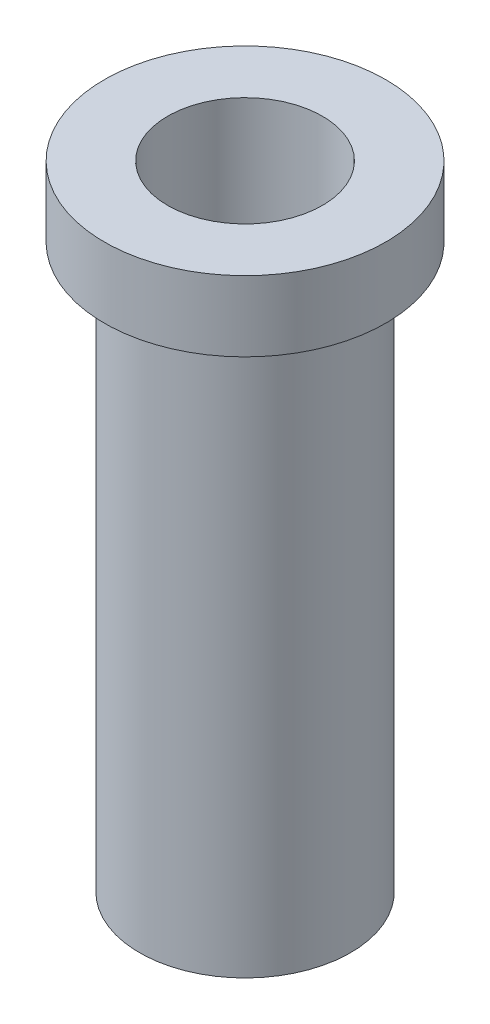
ISO-10303-21;
HEADER;
FILE_DESCRIPTION(('STEP AP214'),'2;1');
FILE_NAME('part.step','',(''),(''),'','','');
FILE_SCHEMA(('AUTOMOTIVE_DESIGN { 1 0 10303 214 1 1 1 1 }'));
ENDSEC;
DATA;
#1=APPLICATION_CONTEXT('core data for automotive mechanical design processes');
#2=APPLICATION_PROTOCOL_DEFINITION('international standard','automotive_design',2000,#1);
#3=PRODUCT_CONTEXT('',#1,'mechanical');
#4=PRODUCT('Part','Part','',(#3));
#5=PRODUCT_RELATED_PRODUCT_CATEGORY('part','',(#4));
#6=PRODUCT_DEFINITION_FORMATION('','',#4);
#7=PRODUCT_DEFINITION_CONTEXT('part definition',#1,'design');
#8=PRODUCT_DEFINITION('design','',#6,#7);
#9=PRODUCT_DEFINITION_SHAPE('','',#8);
#10=(LENGTH_UNIT() NAMED_UNIT(*) SI_UNIT(.MILLI.,.METRE.));
#11=(NAMED_UNIT(*) PLANE_ANGLE_UNIT() SI_UNIT($,.RADIAN.));
#12=(NAMED_UNIT(*) SI_UNIT($,.STERADIAN.) SOLID_ANGLE_UNIT());
#13=UNCERTAINTY_MEASURE_WITH_UNIT(LENGTH_MEASURE(1.E-05),#10,'distance_accuracy_value','');
#14=(GEOMETRIC_REPRESENTATION_CONTEXT(3) GLOBAL_UNCERTAINTY_ASSIGNED_CONTEXT((#13)) GLOBAL_UNIT_ASSIGNED_CONTEXT((#10,
#11,#12)) REPRESENTATION_CONTEXT('',''));
#15=CARTESIAN_POINT('',(0.,0.,0.));
#16=DIRECTION('',(0.,0.,1.));
#17=DIRECTION('',(1.,0.,0.));
#18=AXIS2_PLACEMENT_3D('',#15,#16,#17);
#19=CARTESIAN_POINT('',(7.5,0.,0.));
#20=DIRECTION('',(0.,-1.,0.));
#21=DIRECTION('',(0.,0.,-1.));
#22=AXIS2_PLACEMENT_3D('',#19,#20,#21);
#23=PLANE('',#22);
#24=CARTESIAN_POINT('',(0.,0.,0.));
#25=DIRECTION('',(0.,1.,0.));
#26=DIRECTION('',(0.,0.,1.));
#27=AXIS2_PLACEMENT_3D('',#24,#25,#26);
#28=CIRCLE('',#27,5.5);
#29=CARTESIAN_POINT('',(0.,0.,5.5));
#30=VERTEX_POINT('',#29);
#31=EDGE_CURVE('E56',#30,#30,#28,.T.);
#32=ORIENTED_EDGE('',*,*,#31,.T.);
#33=EDGE_LOOP('',(#32));
#34=FACE_BOUND('',#33,.T.);
#35=CARTESIAN_POINT('',(0.,0.,0.));
#36=DIRECTION('',(0.,-1.,0.));
#37=DIRECTION('',(0.,0.,-1.));
#38=AXIS2_PLACEMENT_3D('',#35,#36,#37);
#39=CIRCLE('',#38,7.5);
#40=CARTESIAN_POINT('',(0.,0.,-7.5));
#41=VERTEX_POINT('',#40);
#42=EDGE_CURVE('E51',#41,#41,#39,.T.);
#43=ORIENTED_EDGE('',*,*,#42,.T.);
#44=EDGE_LOOP('',(#43));
#45=FACE_BOUND('',#44,.T.);
#46=ADVANCED_FACE('F37',(#34,#45),#23,.T.);
#47=CARTESIAN_POINT('',(0.,45.,0.));
#48=DIRECTION('',(0.,1.,0.));
#49=DIRECTION('',(0.,0.,1.));
#50=AXIS2_PLACEMENT_3D('',#47,#48,#49);
#51=PLANE('',#50);
#52=CARTESIAN_POINT('',(0.,45.,0.));
#53=DIRECTION('',(0.,1.,0.));
#54=DIRECTION('',(0.,0.,1.));
#55=AXIS2_PLACEMENT_3D('',#52,#53,#54);
#56=CIRCLE('',#55,5.5);
#57=CARTESIAN_POINT('',(0.,45.,5.5));
#58=VERTEX_POINT('',#57);
#59=EDGE_CURVE('E57',#58,#58,#56,.T.);
#60=ORIENTED_EDGE('',*,*,#59,.F.);
#61=EDGE_LOOP('',(#60));
#62=FACE_BOUND('',#61,.T.);
#63=CARTESIAN_POINT('',(0.,45.,0.));
#64=DIRECTION('',(0.,-1.,0.));
#65=DIRECTION('',(0.,0.,-1.));
#66=AXIS2_PLACEMENT_3D('',#63,#64,#65);
#67=CIRCLE('',#66,10.);
#68=CARTESIAN_POINT('',(0.,45.,-10.));
#69=VERTEX_POINT('',#68);
#70=EDGE_CURVE('E10',#69,#69,#67,.T.);
#71=ORIENTED_EDGE('',*,*,#70,.F.);
#72=EDGE_LOOP('',(#71));
#73=FACE_BOUND('',#72,.T.);
#74=ADVANCED_FACE('F72',(#62,#73),#51,.T.);
#75=CARTESIAN_POINT('',(0.,0.,0.));
#76=DIRECTION('',(0.,-1.,0.));
#77=DIRECTION('',(0.,0.,-1.));
#78=AXIS2_PLACEMENT_3D('',#75,#76,#77);
#79=CYLINDRICAL_SURFACE('',#78,10.);
#80=ORIENTED_EDGE('',*,*,#70,.T.);
#81=EDGE_LOOP('',(#80));
#82=FACE_BOUND('',#81,.T.);
#83=CARTESIAN_POINT('',(0.,40.,0.));
#84=DIRECTION('',(0.,-1.,0.));
#85=DIRECTION('',(0.,0.,-1.));
#86=AXIS2_PLACEMENT_3D('',#83,#84,#85);
#87=CIRCLE('',#86,10.);
#88=CARTESIAN_POINT('',(0.,40.,-10.));
#89=VERTEX_POINT('',#88);
#90=EDGE_CURVE('E43',#89,#89,#87,.T.);
#91=ORIENTED_EDGE('',*,*,#90,.F.);
#92=EDGE_LOOP('',(#91));
#93=FACE_BOUND('',#92,.T.);
#94=ADVANCED_FACE('F75',(#82,#93),#79,.T.);
#95=CARTESIAN_POINT('',(10.,40.,0.));
#96=DIRECTION('',(0.,-1.,0.));
#97=DIRECTION('',(0.,0.,-1.));
#98=AXIS2_PLACEMENT_3D('',#95,#96,#97);
#99=PLANE('',#98);
#100=ORIENTED_EDGE('',*,*,#90,.T.);
#101=EDGE_LOOP('',(#100));
#102=FACE_BOUND('',#101,.T.);
#103=CARTESIAN_POINT('',(0.,40.,0.));
#104=DIRECTION('',(0.,-1.,0.));
#105=DIRECTION('',(0.,0.,-1.));
#106=AXIS2_PLACEMENT_3D('',#103,#104,#105);
#107=CIRCLE('',#106,7.49999999999999);
#108=CARTESIAN_POINT('',(0.,40.,-7.49999999999999));
#109=VERTEX_POINT('',#108);
#110=EDGE_CURVE('E47',#109,#109,#107,.T.);
#111=ORIENTED_EDGE('',*,*,#110,.F.);
#112=EDGE_LOOP('',(#111));
#113=FACE_BOUND('',#112,.T.);
#114=ADVANCED_FACE('F80',(#102,#113),#99,.T.);
#115=CARTESIAN_POINT('',(0.,0.,0.));
#116=DIRECTION('',(0.,-1.,0.));
#117=DIRECTION('',(0.,0.,-1.));
#118=AXIS2_PLACEMENT_3D('',#115,#116,#117);
#119=CYLINDRICAL_SURFACE('',#118,7.5);
#120=ORIENTED_EDGE('',*,*,#110,.T.);
#121=EDGE_LOOP('',(#120));
#122=FACE_BOUND('',#121,.T.);
#123=ORIENTED_EDGE('',*,*,#42,.F.);
#124=EDGE_LOOP('',(#123));
#125=FACE_BOUND('',#124,.T.);
#126=ADVANCED_FACE('F68',(#122,#125),#119,.T.);
#127=CARTESIAN_POINT('',(0.,0.,0.));
#128=DIRECTION('',(0.,1.,0.));
#129=DIRECTION('',(0.,0.,1.));
#130=AXIS2_PLACEMENT_3D('',#127,#128,#129);
#131=CYLINDRICAL_SURFACE('',#130,5.5);
#132=CARTESIAN_POINT('',(0.,0.,5.5));
#133=CARTESIAN_POINT('',(0.,0.468749999999999,5.5));
#134=CARTESIAN_POINT('',(0.,0.9375,5.5));
#135=CARTESIAN_POINT('',(0.,1.875,5.5));
#136=CARTESIAN_POINT('',(0.,2.34375,5.5));
#137=CARTESIAN_POINT('',(0.,3.28125,5.5));
#138=CARTESIAN_POINT('',(0.,3.75,5.5));
#139=CARTESIAN_POINT('',(0.,4.6875,5.5));
#140=CARTESIAN_POINT('',(0.,5.15625,5.5));
#141=CARTESIAN_POINT('',(0.,6.09375,5.5));
#142=CARTESIAN_POINT('',(0.,6.5625,5.5));
#143=CARTESIAN_POINT('',(0.,7.5,5.5));
#144=CARTESIAN_POINT('',(0.,7.96875,5.5));
#145=CARTESIAN_POINT('',(0.,8.90625,5.5));
#146=CARTESIAN_POINT('',(0.,9.375,5.5));
#147=CARTESIAN_POINT('',(0.,10.3125,5.5));
#148=CARTESIAN_POINT('',(0.,10.78125,5.5));
#149=CARTESIAN_POINT('',(0.,11.71875,5.5));
#150=CARTESIAN_POINT('',(0.,12.1875,5.5));
#151=CARTESIAN_POINT('',(0.,13.125,5.5));
#152=CARTESIAN_POINT('',(0.,13.59375,5.5));
#153=CARTESIAN_POINT('',(0.,14.53125,5.5));
#154=CARTESIAN_POINT('',(0.,15.,5.5));
#155=CARTESIAN_POINT('',(0.,15.9375,5.5));
#156=CARTESIAN_POINT('',(0.,16.40625,5.5));
#157=CARTESIAN_POINT('',(0.,17.34375,5.5));
#158=CARTESIAN_POINT('',(0.,17.8125,5.5));
#159=CARTESIAN_POINT('',(0.,18.75,5.5));
#160=CARTESIAN_POINT('',(0.,19.21875,5.5));
#161=CARTESIAN_POINT('',(0.,20.15625,5.5));
#162=CARTESIAN_POINT('',(0.,20.625,5.5));
#163=CARTESIAN_POINT('',(0.,21.5625,5.5));
#164=CARTESIAN_POINT('',(0.,22.03125,5.5));
#165=CARTESIAN_POINT('',(0.,22.96875,5.5));
#166=CARTESIAN_POINT('',(0.,23.4375,5.5));
#167=CARTESIAN_POINT('',(0.,24.375,5.5));
#168=CARTESIAN_POINT('',(0.,24.84375,5.5));
#169=CARTESIAN_POINT('',(0.,25.78125,5.5));
#170=CARTESIAN_POINT('',(0.,26.25,5.5));
#171=CARTESIAN_POINT('',(0.,27.1875,5.5));
#172=CARTESIAN_POINT('',(0.,27.65625,5.5));
#173=CARTESIAN_POINT('',(0.,28.59375,5.5));
#174=CARTESIAN_POINT('',(0.,29.0625,5.5));
#175=CARTESIAN_POINT('',(0.,30.,5.5));
#176=CARTESIAN_POINT('',(0.,30.46875,5.5));
#177=CARTESIAN_POINT('',(0.,31.40625,5.5));
#178=CARTESIAN_POINT('',(0.,31.875,5.5));
#179=CARTESIAN_POINT('',(0.,32.8125,5.5));
#180=CARTESIAN_POINT('',(0.,33.28125,5.5));
#181=CARTESIAN_POINT('',(0.,34.21875,5.5));
#182=CARTESIAN_POINT('',(0.,34.6875,5.5));
#183=CARTESIAN_POINT('',(0.,35.625,5.5));
#184=CARTESIAN_POINT('',(0.,36.09375,5.5));
#185=CARTESIAN_POINT('',(0.,37.03125,5.5));
#186=CARTESIAN_POINT('',(0.,37.5,5.5));
#187=CARTESIAN_POINT('',(0.,38.4375,5.5));
#188=CARTESIAN_POINT('',(0.,38.90625,5.5));
#189=CARTESIAN_POINT('',(0.,39.84375,5.5));
#190=CARTESIAN_POINT('',(0.,40.3125,5.5));
#191=CARTESIAN_POINT('',(0.,41.25,5.5));
#192=CARTESIAN_POINT('',(0.,41.71875,5.5));
#193=CARTESIAN_POINT('',(0.,42.65625,5.5));
#194=CARTESIAN_POINT('',(0.,43.125,5.5));
#195=CARTESIAN_POINT('',(0.,44.0625,5.5));
#196=CARTESIAN_POINT('',(0.,44.53125,5.5));
#197=CARTESIAN_POINT('',(0.,45.,5.5));
#198=B_SPLINE_CURVE_WITH_KNOTS('',3,(#132,#133,#134,#135,#136,#137,#138,#139,#140,#141,#142,
#143,#144,#145,#146,#147,#148,#149,#150,#151,#152,#153,#154,#155,#156,#157,#158,#159,#160,#161,
#162,#163,#164,#165,#166,#167,#168,#169,#170,#171,#172,#173,#174,#175,#176,#177,#178,#179,#180,
#181,#182,#183,#184,#185,#186,#187,#188,#189,#190,#191,#192,#193,#194,#195,#196,#197),
.UNSPECIFIED.,.F.,.F.,(4,2,2,2,2,2,2,2,2,2,2,2,2,2,2,2,2,2,2,2,2,2,2,2,2,2,2,2,2,2,2,2,4),(0.,
1.40625,2.8125,4.21875,5.625,7.03125,8.4375,9.84375,11.25,12.65625,14.0625,15.46875,16.875,
18.28125,19.6875,21.09375,22.5,23.90625,25.3125,26.71875,28.125,29.53125,30.9375,32.34375,33.75,
35.15625,36.5625,37.96875,39.375,40.78125,42.1875,43.59375,45.),.UNSPECIFIED.);
#199=EDGE_CURVE('BSEAM65',#30,#58,#198,.T.);
#200=ORIENTED_EDGE('',*,*,#31,.F.);
#201=ORIENTED_EDGE('',*,*,#59,.T.);
#202=ORIENTED_EDGE('',*,*,#199,.T.);
#203=ORIENTED_EDGE('',*,*,#199,.F.);
#204=EDGE_LOOP('',(#200,#202,#201,#203));
#205=FACE_BOUND('',#204,.T.);
#206=ADVANCED_FACE('F65',(#205),#131,.F.);
#207=CLOSED_SHELL('',(#46,#74,#94,#114,#126,#206));
#208=MANIFOLD_SOLID_BREP('B2',#207);
#209=ADVANCED_BREP_SHAPE_REPRESENTATION('',(#18,#208),#14);
#210=SHAPE_DEFINITION_REPRESENTATION(#9,#209);
ENDSEC;
END-ISO-10303-21;
